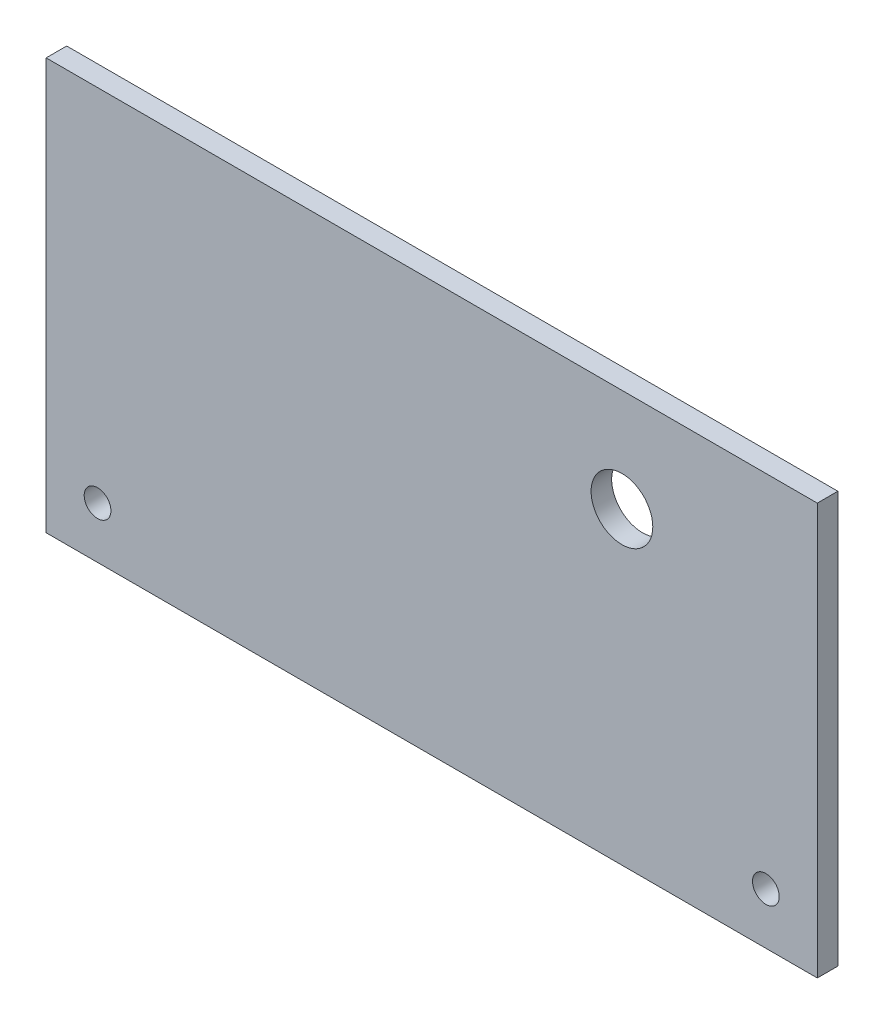
ISO-10303-21;
HEADER;
FILE_DESCRIPTION(('STEP AP214'),'2;1');
FILE_NAME('part.step','',(''),(''),'','','');
FILE_SCHEMA(('AUTOMOTIVE_DESIGN { 1 0 10303 214 1 1 1 1 }'));
ENDSEC;
DATA;
#1=APPLICATION_CONTEXT('core data for automotive mechanical design processes');
#2=APPLICATION_PROTOCOL_DEFINITION('international standard','automotive_design',2000,#1);
#3=PRODUCT_CONTEXT('',#1,'mechanical');
#4=PRODUCT('Part','Part','',(#3));
#5=PRODUCT_RELATED_PRODUCT_CATEGORY('part','',(#4));
#6=PRODUCT_DEFINITION_FORMATION('','',#4);
#7=PRODUCT_DEFINITION_CONTEXT('part definition',#1,'design');
#8=PRODUCT_DEFINITION('design','',#6,#7);
#9=PRODUCT_DEFINITION_SHAPE('','',#8);
#10=(LENGTH_UNIT() NAMED_UNIT(*) SI_UNIT(.MILLI.,.METRE.));
#11=(NAMED_UNIT(*) PLANE_ANGLE_UNIT() SI_UNIT($,.RADIAN.));
#12=(NAMED_UNIT(*) SI_UNIT($,.STERADIAN.) SOLID_ANGLE_UNIT());
#13=UNCERTAINTY_MEASURE_WITH_UNIT(LENGTH_MEASURE(1.E-05),#10,'distance_accuracy_value','');
#14=(GEOMETRIC_REPRESENTATION_CONTEXT(3) GLOBAL_UNCERTAINTY_ASSIGNED_CONTEXT((#13)) GLOBAL_UNIT_ASSIGNED_CONTEXT((#10,
#11,#12)) REPRESENTATION_CONTEXT('',''));
#15=CARTESIAN_POINT('',(0.,0.,0.));
#16=DIRECTION('',(0.,0.,1.));
#17=DIRECTION('',(1.,0.,0.));
#18=AXIS2_PLACEMENT_3D('',#15,#16,#17);
#19=CARTESIAN_POINT('',(-63.1554088500218,36.0621121540065,4.));
#20=DIRECTION('',(1.,0.,0.));
#21=DIRECTION('',(0.,1.,0.));
#22=AXIS2_PLACEMENT_3D('',#19,#20,#21);
#23=PLANE('',#22);
#24=DIRECTION('',(0.,-1.,0.));
#25=VECTOR('',#24,1.);
#26=CARTESIAN_POINT('',(-63.1554088500218,36.0621121540065,0.));
#27=LINE('',#26,#25);
#28=CARTESIAN_POINT('',(-63.1554088500218,36.0621121540065,0.));
#29=VERTEX_POINT('',#28);
#30=CARTESIAN_POINT('',(-63.1554088500218,-43.9378878459935,0.));
#31=VERTEX_POINT('',#30);
#32=EDGE_CURVE('E98',#29,#31,#27,.T.);
#33=ORIENTED_EDGE('',*,*,#32,.T.);
#34=DIRECTION('',(0.,0.,-1.));
#35=VECTOR('',#34,1.);
#36=CARTESIAN_POINT('',(-63.1554088500218,-43.9378878459935,4.));
#37=LINE('',#36,#35);
#38=CARTESIAN_POINT('',(-63.1554088500218,-43.9378878459935,4.));
#39=VERTEX_POINT('',#38);
#40=EDGE_CURVE('E11',#39,#31,#37,.T.);
#41=ORIENTED_EDGE('',*,*,#40,.F.);
#42=DIRECTION('',(0.,-1.,0.));
#43=VECTOR('',#42,1.);
#44=CARTESIAN_POINT('',(-63.1554088500218,36.0621121540065,4.));
#45=LINE('',#44,#43);
#46=CARTESIAN_POINT('',(-63.1554088500218,36.0621121540065,4.));
#47=VERTEX_POINT('',#46);
#48=EDGE_CURVE('E85',#47,#39,#45,.T.);
#49=ORIENTED_EDGE('',*,*,#48,.F.);
#50=DIRECTION('',(0.,0.,-1.));
#51=VECTOR('',#50,1.);
#52=CARTESIAN_POINT('',(-63.1554088500218,36.0621121540065,4.));
#53=LINE('',#52,#51);
#54=EDGE_CURVE('E94',#47,#29,#53,.T.);
#55=ORIENTED_EDGE('',*,*,#54,.T.);
#56=EDGE_LOOP('',(#33,#41,#49,#55));
#57=FACE_BOUND('',#56,.T.);
#58=ADVANCED_FACE('F32',(#57),#23,.F.);
#59=CARTESIAN_POINT('',(-63.1554088500218,-43.9378878459935,4.));
#60=DIRECTION('',(0.,1.,0.));
#61=DIRECTION('',(0.,0.,1.));
#62=AXIS2_PLACEMENT_3D('',#59,#60,#61);
#63=PLANE('',#62);
#64=DIRECTION('',(1.,0.,0.));
#65=VECTOR('',#64,1.);
#66=CARTESIAN_POINT('',(-63.1554088500218,-43.9378878459935,0.));
#67=LINE('',#66,#65);
#68=CARTESIAN_POINT('',(86.8445911499782,-43.9378878459935,0.));
#69=VERTEX_POINT('',#68);
#70=EDGE_CURVE('E89',#31,#69,#67,.T.);
#71=ORIENTED_EDGE('',*,*,#70,.T.);
#72=DIRECTION('',(0.,0.,-1.));
#73=VECTOR('',#72,1.);
#74=CARTESIAN_POINT('',(86.8445911499782,-43.9378878459935,4.));
#75=LINE('',#74,#73);
#76=CARTESIAN_POINT('',(86.8445911499782,-43.9378878459935,4.));
#77=VERTEX_POINT('',#76);
#78=EDGE_CURVE('E41',#77,#69,#75,.T.);
#79=ORIENTED_EDGE('',*,*,#78,.F.);
#80=DIRECTION('',(1.,0.,0.));
#81=VECTOR('',#80,1.);
#82=CARTESIAN_POINT('',(-63.1554088500218,-43.9378878459935,4.));
#83=LINE('',#82,#81);
#84=EDGE_CURVE('E80',#39,#77,#83,.T.);
#85=ORIENTED_EDGE('',*,*,#84,.F.);
#86=ORIENTED_EDGE('',*,*,#40,.T.);
#87=EDGE_LOOP('',(#71,#79,#85,#86));
#88=FACE_BOUND('',#87,.T.);
#89=ADVANCED_FACE('F88',(#88),#63,.F.);
#90=CARTESIAN_POINT('',(86.8445911499782,36.0621121540065,4.));
#91=DIRECTION('',(-1.,0.,0.));
#92=DIRECTION('',(0.,-1.,0.));
#93=AXIS2_PLACEMENT_3D('',#90,#91,#92);
#94=PLANE('',#93);
#95=DIRECTION('',(0.,1.,0.));
#96=VECTOR('',#95,1.);
#97=CARTESIAN_POINT('',(86.8445911499782,36.0621121540065,0.));
#98=LINE('',#97,#96);
#99=CARTESIAN_POINT('',(86.8445911499782,36.0621121540065,0.));
#100=VERTEX_POINT('',#99);
#101=EDGE_CURVE('E67',#69,#100,#98,.T.);
#102=ORIENTED_EDGE('',*,*,#101,.T.);
#103=DIRECTION('',(0.,0.,-1.));
#104=VECTOR('',#103,1.);
#105=CARTESIAN_POINT('',(86.8445911499782,36.0621121540065,4.));
#106=LINE('',#105,#104);
#107=CARTESIAN_POINT('',(86.8445911499782,36.0621121540065,4.));
#108=VERTEX_POINT('',#107);
#109=EDGE_CURVE('E90',#108,#100,#106,.T.);
#110=ORIENTED_EDGE('',*,*,#109,.F.);
#111=DIRECTION('',(0.,1.,0.));
#112=VECTOR('',#111,1.);
#113=CARTESIAN_POINT('',(86.8445911499782,36.0621121540065,4.));
#114=LINE('',#113,#112);
#115=EDGE_CURVE('E83',#77,#108,#114,.T.);
#116=ORIENTED_EDGE('',*,*,#115,.F.);
#117=ORIENTED_EDGE('',*,*,#78,.T.);
#118=EDGE_LOOP('',(#102,#110,#116,#117));
#119=FACE_BOUND('',#118,.T.);
#120=ADVANCED_FACE('F92',(#119),#94,.F.);
#121=CARTESIAN_POINT('',(-63.1554088500218,36.0621121540065,4.));
#122=DIRECTION('',(0.,-1.,0.));
#123=DIRECTION('',(0.,0.,-1.));
#124=AXIS2_PLACEMENT_3D('',#121,#122,#123);
#125=PLANE('',#124);
#126=DIRECTION('',(-1.,0.,0.));
#127=VECTOR('',#126,1.);
#128=CARTESIAN_POINT('',(-63.1554088500218,36.0621121540065,0.));
#129=LINE('',#128,#127);
#130=EDGE_CURVE('E73',#100,#29,#129,.T.);
#131=ORIENTED_EDGE('',*,*,#130,.T.);
#132=ORIENTED_EDGE('',*,*,#54,.F.);
#133=DIRECTION('',(-1.,0.,0.));
#134=VECTOR('',#133,1.);
#135=CARTESIAN_POINT('',(-63.1554088500218,36.0621121540065,4.));
#136=LINE('',#135,#134);
#137=EDGE_CURVE('E50',#108,#47,#136,.T.);
#138=ORIENTED_EDGE('',*,*,#137,.F.);
#139=ORIENTED_EDGE('',*,*,#109,.T.);
#140=EDGE_LOOP('',(#131,#132,#138,#139));
#141=FACE_BOUND('',#140,.T.);
#142=ADVANCED_FACE('F131',(#141),#125,.F.);
#143=CARTESIAN_POINT('',(-63.1554088500218,-43.9378878459935,4.));
#144=DIRECTION('',(0.,0.,1.));
#145=DIRECTION('',(1.,0.,0.));
#146=AXIS2_PLACEMENT_3D('',#143,#144,#145);
#147=PLANE('',#146);
#148=CARTESIAN_POINT('',(76.8445911499782,-33.9378878459935,4.));
#149=DIRECTION('',(0.,0.,1.));
#150=DIRECTION('',(1.,0.,0.));
#151=AXIS2_PLACEMENT_3D('',#148,#149,#150);
#152=CIRCLE('',#151,2.6);
#153=CARTESIAN_POINT('',(79.4445911499782,-33.9378878459935,4.));
#154=VERTEX_POINT('',#153);
#155=EDGE_CURVE('E112',#154,#154,#152,.T.);
#156=ORIENTED_EDGE('',*,*,#155,.F.);
#157=EDGE_LOOP('',(#156));
#158=FACE_BOUND('',#157,.T.);
#159=CARTESIAN_POINT('',(-53.1554088500218,-33.9378878459935,4.));
#160=DIRECTION('',(0.,0.,1.));
#161=DIRECTION('',(1.,0.,0.));
#162=AXIS2_PLACEMENT_3D('',#159,#160,#161);
#163=CIRCLE('',#162,2.6);
#164=CARTESIAN_POINT('',(-50.5554088500218,-33.9378878459935,4.));
#165=VERTEX_POINT('',#164);
#166=EDGE_CURVE('E109',#165,#165,#163,.T.);
#167=ORIENTED_EDGE('',*,*,#166,.F.);
#168=EDGE_LOOP('',(#167));
#169=FACE_BOUND('',#168,.T.);
#170=CARTESIAN_POINT('',(48.8445911499782,16.0621121540065,4.));
#171=DIRECTION('',(0.,0.,1.));
#172=DIRECTION('',(1.,0.,0.));
#173=AXIS2_PLACEMENT_3D('',#170,#171,#172);
#174=CIRCLE('',#173,6.);
#175=CARTESIAN_POINT('',(54.8445911499782,16.0621121540065,4.));
#176=VERTEX_POINT('',#175);
#177=EDGE_CURVE('E101',#176,#176,#174,.T.);
#178=ORIENTED_EDGE('',*,*,#177,.F.);
#179=EDGE_LOOP('',(#178));
#180=FACE_BOUND('',#179,.T.);
#181=ORIENTED_EDGE('',*,*,#48,.T.);
#182=ORIENTED_EDGE('',*,*,#84,.T.);
#183=ORIENTED_EDGE('',*,*,#115,.T.);
#184=ORIENTED_EDGE('',*,*,#137,.T.);
#185=EDGE_LOOP('',(#181,#182,#183,#184));
#186=FACE_BOUND('',#185,.T.);
#187=ADVANCED_FACE('F81',(#158,#169,#180,#186),#147,.T.);
#188=CARTESIAN_POINT('',(-63.1554088500218,-43.9378878459935,0.));
#189=DIRECTION('',(0.,0.,1.));
#190=DIRECTION('',(1.,0.,0.));
#191=AXIS2_PLACEMENT_3D('',#188,#189,#190);
#192=PLANE('',#191);
#193=CARTESIAN_POINT('',(76.8445911499782,-33.9378878459935,0.));
#194=DIRECTION('',(0.,0.,1.));
#195=DIRECTION('',(1.,0.,0.));
#196=AXIS2_PLACEMENT_3D('',#193,#194,#195);
#197=CIRCLE('',#196,2.6);
#198=CARTESIAN_POINT('',(79.4445911499782,-33.9378878459935,0.));
#199=VERTEX_POINT('',#198);
#200=EDGE_CURVE('E35',#199,#199,#197,.T.);
#201=ORIENTED_EDGE('',*,*,#200,.T.);
#202=EDGE_LOOP('',(#201));
#203=FACE_BOUND('',#202,.T.);
#204=CARTESIAN_POINT('',(-53.1554088500218,-33.9378878459935,0.));
#205=DIRECTION('',(0.,0.,1.));
#206=DIRECTION('',(1.,0.,0.));
#207=AXIS2_PLACEMENT_3D('',#204,#205,#206);
#208=CIRCLE('',#207,2.6);
#209=CARTESIAN_POINT('',(-50.5554088500218,-33.9378878459935,0.));
#210=VERTEX_POINT('',#209);
#211=EDGE_CURVE('E110',#210,#210,#208,.T.);
#212=ORIENTED_EDGE('',*,*,#211,.T.);
#213=EDGE_LOOP('',(#212));
#214=FACE_BOUND('',#213,.T.);
#215=CARTESIAN_POINT('',(48.8445911499782,16.0621121540065,0.));
#216=DIRECTION('',(0.,0.,1.));
#217=DIRECTION('',(1.,0.,0.));
#218=AXIS2_PLACEMENT_3D('',#215,#216,#217);
#219=CIRCLE('',#218,6.);
#220=CARTESIAN_POINT('',(54.8445911499782,16.0621121540065,0.));
#221=VERTEX_POINT('',#220);
#222=EDGE_CURVE('E107',#221,#221,#219,.T.);
#223=ORIENTED_EDGE('',*,*,#222,.T.);
#224=EDGE_LOOP('',(#223));
#225=FACE_BOUND('',#224,.T.);
#226=ORIENTED_EDGE('',*,*,#32,.F.);
#227=ORIENTED_EDGE('',*,*,#130,.F.);
#228=ORIENTED_EDGE('',*,*,#101,.F.);
#229=ORIENTED_EDGE('',*,*,#70,.F.);
#230=EDGE_LOOP('',(#226,#227,#228,#229));
#231=FACE_BOUND('',#230,.T.);
#232=ADVANCED_FACE('F130',(#203,#214,#225,#231),#192,.F.);
#233=CARTESIAN_POINT('',(48.8445911499782,16.0621121540065,-23.));
#234=DIRECTION('',(0.,0.,1.));
#235=DIRECTION('',(1.,0.,0.));
#236=AXIS2_PLACEMENT_3D('',#233,#234,#235);
#237=CYLINDRICAL_SURFACE('',#236,6.);
#238=ORIENTED_EDGE('',*,*,#177,.T.);
#239=EDGE_LOOP('',(#238));
#240=FACE_BOUND('',#239,.T.);
#241=ORIENTED_EDGE('',*,*,#222,.F.);
#242=EDGE_LOOP('',(#241));
#243=FACE_BOUND('',#242,.T.);
#244=ADVANCED_FACE('F126',(#240,#243),#237,.F.);
#245=CARTESIAN_POINT('',(-53.1554088500218,-33.9378878459935,-23.));
#246=DIRECTION('',(0.,0.,1.));
#247=DIRECTION('',(1.,0.,0.));
#248=AXIS2_PLACEMENT_3D('',#245,#246,#247);
#249=CYLINDRICAL_SURFACE('',#248,2.6);
#250=ORIENTED_EDGE('',*,*,#166,.T.);
#251=EDGE_LOOP('',(#250));
#252=FACE_BOUND('',#251,.T.);
#253=ORIENTED_EDGE('',*,*,#211,.F.);
#254=EDGE_LOOP('',(#253));
#255=FACE_BOUND('',#254,.T.);
#256=ADVANCED_FACE('F179',(#252,#255),#249,.F.);
#257=CARTESIAN_POINT('',(76.8445911499782,-33.9378878459935,-23.));
#258=DIRECTION('',(0.,0.,1.));
#259=DIRECTION('',(1.,0.,0.));
#260=AXIS2_PLACEMENT_3D('',#257,#258,#259);
#261=CYLINDRICAL_SURFACE('',#260,2.6);
#262=ORIENTED_EDGE('',*,*,#155,.T.);
#263=EDGE_LOOP('',(#262));
#264=FACE_BOUND('',#263,.T.);
#265=ORIENTED_EDGE('',*,*,#200,.F.);
#266=EDGE_LOOP('',(#265));
#267=FACE_BOUND('',#266,.T.);
#268=ADVANCED_FACE('F187',(#264,#267),#261,.F.);
#269=CLOSED_SHELL('',(#58,#89,#120,#142,#187,#232,#244,#256,#268));
#270=MANIFOLD_SOLID_BREP('B2',#269);
#271=ADVANCED_BREP_SHAPE_REPRESENTATION('',(#18,#270),#14);
#272=SHAPE_DEFINITION_REPRESENTATION(#9,#271);
ENDSEC;
END-ISO-10303-21;
